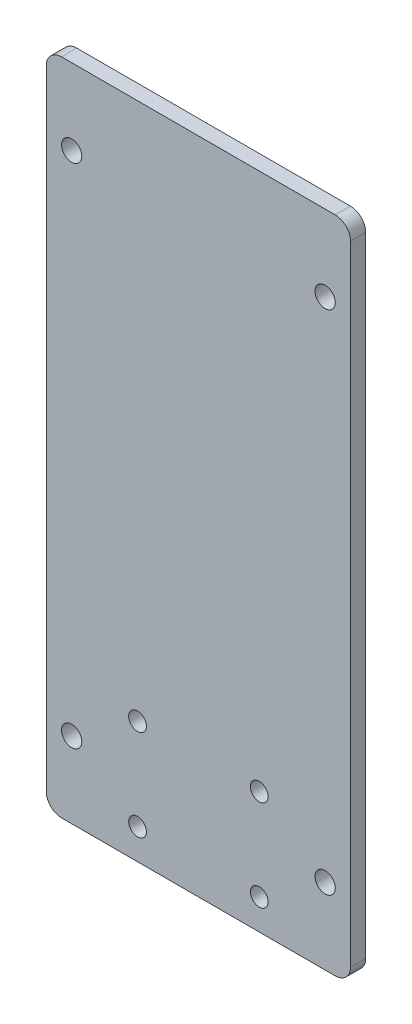
ISO-10303-21;
HEADER;
FILE_DESCRIPTION(('STEP AP214'),'2;1');
FILE_NAME('part.step','',(''),(''),'','','');
FILE_SCHEMA(('AUTOMOTIVE_DESIGN { 1 0 10303 214 1 1 1 1 }'));
ENDSEC;
DATA;
#1=APPLICATION_CONTEXT('core data for automotive mechanical design processes');
#2=APPLICATION_PROTOCOL_DEFINITION('international standard','automotive_design',2000,#1);
#3=PRODUCT_CONTEXT('',#1,'mechanical');
#4=PRODUCT('Part','Part','',(#3));
#5=PRODUCT_RELATED_PRODUCT_CATEGORY('part','',(#4));
#6=PRODUCT_DEFINITION_FORMATION('','',#4);
#7=PRODUCT_DEFINITION_CONTEXT('part definition',#1,'design');
#8=PRODUCT_DEFINITION('design','',#6,#7);
#9=PRODUCT_DEFINITION_SHAPE('','',#8);
#10=(LENGTH_UNIT() NAMED_UNIT(*) SI_UNIT(.MILLI.,.METRE.));
#11=(NAMED_UNIT(*) PLANE_ANGLE_UNIT() SI_UNIT($,.RADIAN.));
#12=(NAMED_UNIT(*) SI_UNIT($,.STERADIAN.) SOLID_ANGLE_UNIT());
#13=UNCERTAINTY_MEASURE_WITH_UNIT(LENGTH_MEASURE(1.E-05),#10,'distance_accuracy_value','');
#14=(GEOMETRIC_REPRESENTATION_CONTEXT(3) GLOBAL_UNCERTAINTY_ASSIGNED_CONTEXT((#13)) GLOBAL_UNIT_ASSIGNED_CONTEXT((#10,
#11,#12)) REPRESENTATION_CONTEXT('',''));
#15=CARTESIAN_POINT('',(0.,0.,0.));
#16=DIRECTION('',(0.,0.,1.));
#17=DIRECTION('',(1.,0.,0.));
#18=AXIS2_PLACEMENT_3D('',#15,#16,#17);
#19=CARTESIAN_POINT('',(0.,0.,3.));
#20=DIRECTION('',(1.,0.,0.));
#21=DIRECTION('',(0.,0.,-1.));
#22=AXIS2_PLACEMENT_3D('',#19,#20,#21);
#23=PLANE('',#22);
#24=DIRECTION('',(0.,-1.,0.));
#25=VECTOR('',#24,1.);
#26=CARTESIAN_POINT('',(0.,0.,0.));
#27=LINE('',#26,#25);
#28=CARTESIAN_POINT('',(0.,127.,0.));
#29=VERTEX_POINT('',#28);
#30=CARTESIAN_POINT('',(0.,3.,0.));
#31=VERTEX_POINT('',#30);
#32=EDGE_CURVE('E131',#29,#31,#27,.T.);
#33=ORIENTED_EDGE('',*,*,#32,.T.);
#34=DIRECTION('',(0.,0.,-1.));
#35=VECTOR('',#34,1.);
#36=CARTESIAN_POINT('',(0.,3.,3.));
#37=LINE('',#36,#35);
#38=CARTESIAN_POINT('',(0.,3.,3.));
#39=VERTEX_POINT('',#38);
#40=EDGE_CURVE('E153',#31,#39,#37,.F.);
#41=ORIENTED_EDGE('',*,*,#40,.T.);
#42=DIRECTION('',(0.,-1.,0.));
#43=VECTOR('',#42,1.);
#44=CARTESIAN_POINT('',(0.,0.,3.));
#45=LINE('',#44,#43);
#46=CARTESIAN_POINT('',(0.,127.,3.));
#47=VERTEX_POINT('',#46);
#48=EDGE_CURVE('E129',#47,#39,#45,.T.);
#49=ORIENTED_EDGE('',*,*,#48,.F.);
#50=DIRECTION('',(0.,0.,-1.));
#51=VECTOR('',#50,1.);
#52=CARTESIAN_POINT('',(0.,127.,3.));
#53=LINE('',#52,#51);
#54=EDGE_CURVE('E150',#47,#29,#53,.T.);
#55=ORIENTED_EDGE('',*,*,#54,.T.);
#56=EDGE_LOOP('',(#33,#41,#49,#55));
#57=FACE_BOUND('',#56,.T.);
#58=ADVANCED_FACE('F34',(#57),#23,.F.);
#59=CARTESIAN_POINT('',(0.,0.,3.));
#60=DIRECTION('',(0.,1.,0.));
#61=DIRECTION('',(0.,0.,1.));
#62=AXIS2_PLACEMENT_3D('',#59,#60,#61);
#63=PLANE('',#62);
#64=DIRECTION('',(1.,0.,0.));
#65=VECTOR('',#64,1.);
#66=CARTESIAN_POINT('',(0.,0.,0.));
#67=LINE('',#66,#65);
#68=CARTESIAN_POINT('',(3.,0.,0.));
#69=VERTEX_POINT('',#68);
#70=CARTESIAN_POINT('',(57.,0.,0.));
#71=VERTEX_POINT('',#70);
#72=EDGE_CURVE('E127',#69,#71,#67,.T.);
#73=ORIENTED_EDGE('',*,*,#72,.T.);
#74=DIRECTION('',(0.,0.,-1.));
#75=VECTOR('',#74,1.);
#76=CARTESIAN_POINT('',(57.,0.,3.));
#77=LINE('',#76,#75);
#78=CARTESIAN_POINT('',(57.,0.,3.));
#79=VERTEX_POINT('',#78);
#80=EDGE_CURVE('E105',#71,#79,#77,.F.);
#81=ORIENTED_EDGE('',*,*,#80,.T.);
#82=DIRECTION('',(1.,0.,0.));
#83=VECTOR('',#82,1.);
#84=CARTESIAN_POINT('',(0.,0.,3.));
#85=LINE('',#84,#83);
#86=CARTESIAN_POINT('',(3.,0.,3.));
#87=VERTEX_POINT('',#86);
#88=EDGE_CURVE('E167',#87,#79,#85,.T.);
#89=ORIENTED_EDGE('',*,*,#88,.F.);
#90=DIRECTION('',(0.,0.,-1.));
#91=VECTOR('',#90,1.);
#92=CARTESIAN_POINT('',(3.,0.,3.));
#93=LINE('',#92,#91);
#94=EDGE_CURVE('E110',#87,#69,#93,.T.);
#95=ORIENTED_EDGE('',*,*,#94,.T.);
#96=EDGE_LOOP('',(#73,#81,#89,#95));
#97=FACE_BOUND('',#96,.T.);
#98=ADVANCED_FACE('F172',(#97),#63,.F.);
#99=CARTESIAN_POINT('',(60.,0.,3.));
#100=DIRECTION('',(-1.,0.,0.));
#101=DIRECTION('',(0.,0.,1.));
#102=AXIS2_PLACEMENT_3D('',#99,#100,#101);
#103=PLANE('',#102);
#104=DIRECTION('',(0.,1.,0.));
#105=VECTOR('',#104,1.);
#106=CARTESIAN_POINT('',(60.,0.,3.));
#107=LINE('',#106,#105);
#108=CARTESIAN_POINT('',(60.,3.,3.));
#109=VERTEX_POINT('',#108);
#110=CARTESIAN_POINT('',(60.,127.,3.));
#111=VERTEX_POINT('',#110);
#112=EDGE_CURVE('E119',#109,#111,#107,.T.);
#113=ORIENTED_EDGE('',*,*,#112,.F.);
#114=DIRECTION('',(0.,0.,-1.));
#115=VECTOR('',#114,1.);
#116=CARTESIAN_POINT('',(60.,3.,3.));
#117=LINE('',#116,#115);
#118=CARTESIAN_POINT('',(60.,3.,0.));
#119=VERTEX_POINT('',#118);
#120=EDGE_CURVE('E104',#109,#119,#117,.T.);
#121=ORIENTED_EDGE('',*,*,#120,.T.);
#122=DIRECTION('',(0.,1.,0.));
#123=VECTOR('',#122,1.);
#124=CARTESIAN_POINT('',(60.,0.,0.));
#125=LINE('',#124,#123);
#126=CARTESIAN_POINT('',(60.,127.,0.));
#127=VERTEX_POINT('',#126);
#128=EDGE_CURVE('E117',#119,#127,#125,.T.);
#129=ORIENTED_EDGE('',*,*,#128,.T.);
#130=DIRECTION('',(0.,0.,-1.));
#131=VECTOR('',#130,1.);
#132=CARTESIAN_POINT('',(60.,127.,3.));
#133=LINE('',#132,#131);
#134=EDGE_CURVE('E121',#127,#111,#133,.F.);
#135=ORIENTED_EDGE('',*,*,#134,.T.);
#136=EDGE_LOOP('',(#113,#121,#129,#135));
#137=FACE_BOUND('',#136,.T.);
#138=ADVANCED_FACE('F116',(#137),#103,.F.);
#139=CARTESIAN_POINT('',(0.,130.,3.));
#140=DIRECTION('',(0.,-1.,0.));
#141=DIRECTION('',(0.,0.,-1.));
#142=AXIS2_PLACEMENT_3D('',#139,#140,#141);
#143=PLANE('',#142);
#144=DIRECTION('',(-1.,0.,0.));
#145=VECTOR('',#144,1.);
#146=CARTESIAN_POINT('',(0.,130.,3.));
#147=LINE('',#146,#145);
#148=CARTESIAN_POINT('',(57.,130.,3.));
#149=VERTEX_POINT('',#148);
#150=CARTESIAN_POINT('',(3.,130.,3.));
#151=VERTEX_POINT('',#150);
#152=EDGE_CURVE('E135',#149,#151,#147,.T.);
#153=ORIENTED_EDGE('',*,*,#152,.F.);
#154=DIRECTION('',(0.,0.,-1.));
#155=VECTOR('',#154,1.);
#156=CARTESIAN_POINT('',(57.,130.,3.));
#157=LINE('',#156,#155);
#158=CARTESIAN_POINT('',(57.,130.,0.));
#159=VERTEX_POINT('',#158);
#160=EDGE_CURVE('E11',#149,#159,#157,.T.);
#161=ORIENTED_EDGE('',*,*,#160,.T.);
#162=DIRECTION('',(-1.,0.,0.));
#163=VECTOR('',#162,1.);
#164=CARTESIAN_POINT('',(0.,130.,0.));
#165=LINE('',#164,#163);
#166=CARTESIAN_POINT('',(3.,130.,0.));
#167=VERTEX_POINT('',#166);
#168=EDGE_CURVE('E126',#159,#167,#165,.T.);
#169=ORIENTED_EDGE('',*,*,#168,.T.);
#170=DIRECTION('',(0.,0.,-1.));
#171=VECTOR('',#170,1.);
#172=CARTESIAN_POINT('',(3.,130.,3.));
#173=LINE('',#172,#171);
#174=EDGE_CURVE('E42',#167,#151,#173,.F.);
#175=ORIENTED_EDGE('',*,*,#174,.T.);
#176=EDGE_LOOP('',(#153,#161,#169,#175));
#177=FACE_BOUND('',#176,.T.);
#178=ADVANCED_FACE('F238',(#177),#143,.F.);
#179=CARTESIAN_POINT('',(0.,0.,3.));
#180=DIRECTION('',(0.,0.,-1.));
#181=DIRECTION('',(-1.,0.,0.));
#182=AXIS2_PLACEMENT_3D('',#179,#180,#181);
#183=PLANE('',#182);
#184=CARTESIAN_POINT('',(18.,24.,3.));
#185=DIRECTION('',(0.,0.,1.));
#186=DIRECTION('',(1.,0.,0.));
#187=AXIS2_PLACEMENT_3D('',#184,#185,#186);
#188=CIRCLE('',#187,1.75);
#189=CARTESIAN_POINT('',(19.75,24.,3.));
#190=VERTEX_POINT('',#189);
#191=EDGE_CURVE('E208',#190,#190,#188,.T.);
#192=ORIENTED_EDGE('',*,*,#191,.F.);
#193=EDGE_LOOP('',(#192));
#194=FACE_BOUND('',#193,.T.);
#195=CARTESIAN_POINT('',(18.,6.,3.));
#196=DIRECTION('',(0.,0.,1.));
#197=DIRECTION('',(1.,0.,0.));
#198=AXIS2_PLACEMENT_3D('',#195,#196,#197);
#199=CIRCLE('',#198,1.75);
#200=CARTESIAN_POINT('',(19.75,6.,3.));
#201=VERTEX_POINT('',#200);
#202=EDGE_CURVE('E214',#201,#201,#199,.T.);
#203=ORIENTED_EDGE('',*,*,#202,.F.);
#204=EDGE_LOOP('',(#203));
#205=FACE_BOUND('',#204,.T.);
#206=CARTESIAN_POINT('',(42.,6.,3.));
#207=DIRECTION('',(0.,0.,1.));
#208=DIRECTION('',(1.,0.,0.));
#209=AXIS2_PLACEMENT_3D('',#206,#207,#208);
#210=CIRCLE('',#209,1.75);
#211=CARTESIAN_POINT('',(43.75,6.,3.));
#212=VERTEX_POINT('',#211);
#213=EDGE_CURVE('E220',#212,#212,#210,.T.);
#214=ORIENTED_EDGE('',*,*,#213,.F.);
#215=EDGE_LOOP('',(#214));
#216=FACE_BOUND('',#215,.T.);
#217=CARTESIAN_POINT('',(42.,24.,3.));
#218=DIRECTION('',(0.,0.,1.));
#219=DIRECTION('',(1.,0.,0.));
#220=AXIS2_PLACEMENT_3D('',#217,#218,#219);
#221=CIRCLE('',#220,1.75);
#222=CARTESIAN_POINT('',(43.75,24.,3.));
#223=VERTEX_POINT('',#222);
#224=EDGE_CURVE('E202',#223,#223,#221,.T.);
#225=ORIENTED_EDGE('',*,*,#224,.F.);
#226=EDGE_LOOP('',(#225));
#227=FACE_BOUND('',#226,.T.);
#228=CARTESIAN_POINT('',(55.,115.,3.));
#229=DIRECTION('',(0.,0.,1.));
#230=DIRECTION('',(1.,0.,0.));
#231=AXIS2_PLACEMENT_3D('',#228,#229,#230);
#232=CIRCLE('',#231,2.);
#233=CARTESIAN_POINT('',(57.,115.,3.));
#234=VERTEX_POINT('',#233);
#235=EDGE_CURVE('E182',#234,#234,#232,.T.);
#236=ORIENTED_EDGE('',*,*,#235,.F.);
#237=EDGE_LOOP('',(#236));
#238=FACE_BOUND('',#237,.T.);
#239=CARTESIAN_POINT('',(5.,15.,3.));
#240=DIRECTION('',(0.,0.,1.));
#241=DIRECTION('',(1.,0.,0.));
#242=AXIS2_PLACEMENT_3D('',#239,#240,#241);
#243=CIRCLE('',#242,2.);
#244=CARTESIAN_POINT('',(7.,15.,3.));
#245=VERTEX_POINT('',#244);
#246=EDGE_CURVE('E187',#245,#245,#243,.T.);
#247=ORIENTED_EDGE('',*,*,#246,.F.);
#248=EDGE_LOOP('',(#247));
#249=FACE_BOUND('',#248,.T.);
#250=CARTESIAN_POINT('',(55.,15.,3.));
#251=DIRECTION('',(0.,0.,1.));
#252=DIRECTION('',(1.,0.,0.));
#253=AXIS2_PLACEMENT_3D('',#250,#251,#252);
#254=CIRCLE('',#253,2.);
#255=CARTESIAN_POINT('',(57.,15.,3.));
#256=VERTEX_POINT('',#255);
#257=EDGE_CURVE('E188',#256,#256,#254,.T.);
#258=ORIENTED_EDGE('',*,*,#257,.F.);
#259=EDGE_LOOP('',(#258));
#260=FACE_BOUND('',#259,.T.);
#261=CARTESIAN_POINT('',(5.,115.,3.));
#262=DIRECTION('',(0.,0.,1.));
#263=DIRECTION('',(1.,0.,0.));
#264=AXIS2_PLACEMENT_3D('',#261,#262,#263);
#265=CIRCLE('',#264,2.);
#266=CARTESIAN_POINT('',(7.,115.,3.));
#267=VERTEX_POINT('',#266);
#268=EDGE_CURVE('E173',#267,#267,#265,.T.);
#269=ORIENTED_EDGE('',*,*,#268,.F.);
#270=EDGE_LOOP('',(#269));
#271=FACE_BOUND('',#270,.T.);
#272=ORIENTED_EDGE('',*,*,#88,.T.);
#273=CARTESIAN_POINT('',(57.,3.,3.));
#274=DIRECTION('',(0.,0.,-1.));
#275=DIRECTION('',(-1.,0.,0.));
#276=AXIS2_PLACEMENT_3D('',#273,#274,#275);
#277=CIRCLE('',#276,3.);
#278=EDGE_CURVE('E148',#79,#109,#277,.F.);
#279=ORIENTED_EDGE('',*,*,#278,.T.);
#280=ORIENTED_EDGE('',*,*,#112,.T.);
#281=CARTESIAN_POINT('',(57.,127.,3.));
#282=DIRECTION('',(0.,0.,-1.));
#283=DIRECTION('',(-1.,0.,0.));
#284=AXIS2_PLACEMENT_3D('',#281,#282,#283);
#285=CIRCLE('',#284,3.);
#286=EDGE_CURVE('E55',#111,#149,#285,.F.);
#287=ORIENTED_EDGE('',*,*,#286,.T.);
#288=ORIENTED_EDGE('',*,*,#152,.T.);
#289=CARTESIAN_POINT('',(3.,127.,3.));
#290=DIRECTION('',(0.,0.,-1.));
#291=DIRECTION('',(-1.,0.,0.));
#292=AXIS2_PLACEMENT_3D('',#289,#290,#291);
#293=CIRCLE('',#292,3.);
#294=EDGE_CURVE('E143',#151,#47,#293,.F.);
#295=ORIENTED_EDGE('',*,*,#294,.T.);
#296=ORIENTED_EDGE('',*,*,#48,.T.);
#297=CARTESIAN_POINT('',(3.,3.,3.));
#298=DIRECTION('',(0.,0.,-1.));
#299=DIRECTION('',(-1.,0.,0.));
#300=AXIS2_PLACEMENT_3D('',#297,#298,#299);
#301=CIRCLE('',#300,3.);
#302=EDGE_CURVE('E146',#39,#87,#301,.F.);
#303=ORIENTED_EDGE('',*,*,#302,.T.);
#304=EDGE_LOOP('',(#272,#279,#280,#287,#288,#295,#296,#303));
#305=FACE_BOUND('',#304,.T.);
#306=ADVANCED_FACE('F164',(#194,#205,#216,#227,#238,#249,#260,#271,#305),#183,.F.);
#307=CARTESIAN_POINT('',(0.,0.,0.));
#308=DIRECTION('',(0.,0.,-1.));
#309=DIRECTION('',(-1.,0.,0.));
#310=AXIS2_PLACEMENT_3D('',#307,#308,#309);
#311=PLANE('',#310);
#312=CARTESIAN_POINT('',(18.,24.,0.));
#313=DIRECTION('',(0.,0.,1.));
#314=DIRECTION('',(1.,0.,0.));
#315=AXIS2_PLACEMENT_3D('',#312,#313,#314);
#316=CIRCLE('',#315,1.75);
#317=CARTESIAN_POINT('',(19.75,24.,0.));
#318=VERTEX_POINT('',#317);
#319=EDGE_CURVE('E211',#318,#318,#316,.T.);
#320=ORIENTED_EDGE('',*,*,#319,.T.);
#321=EDGE_LOOP('',(#320));
#322=FACE_BOUND('',#321,.T.);
#323=CARTESIAN_POINT('',(18.,6.,0.));
#324=DIRECTION('',(0.,0.,1.));
#325=DIRECTION('',(1.,0.,0.));
#326=AXIS2_PLACEMENT_3D('',#323,#324,#325);
#327=CIRCLE('',#326,1.75);
#328=CARTESIAN_POINT('',(19.75,6.,0.));
#329=VERTEX_POINT('',#328);
#330=EDGE_CURVE('E217',#329,#329,#327,.T.);
#331=ORIENTED_EDGE('',*,*,#330,.T.);
#332=EDGE_LOOP('',(#331));
#333=FACE_BOUND('',#332,.T.);
#334=CARTESIAN_POINT('',(42.,6.,0.));
#335=DIRECTION('',(0.,0.,1.));
#336=DIRECTION('',(1.,0.,0.));
#337=AXIS2_PLACEMENT_3D('',#334,#335,#336);
#338=CIRCLE('',#337,1.75);
#339=CARTESIAN_POINT('',(43.75,6.,0.));
#340=VERTEX_POINT('',#339);
#341=EDGE_CURVE('E205',#340,#340,#338,.T.);
#342=ORIENTED_EDGE('',*,*,#341,.T.);
#343=EDGE_LOOP('',(#342));
#344=FACE_BOUND('',#343,.T.);
#345=CARTESIAN_POINT('',(42.,24.,0.));
#346=DIRECTION('',(0.,0.,1.));
#347=DIRECTION('',(1.,0.,0.));
#348=AXIS2_PLACEMENT_3D('',#345,#346,#347);
#349=CIRCLE('',#348,1.75);
#350=CARTESIAN_POINT('',(43.75,24.,0.));
#351=VERTEX_POINT('',#350);
#352=EDGE_CURVE('E199',#351,#351,#349,.T.);
#353=ORIENTED_EDGE('',*,*,#352,.T.);
#354=EDGE_LOOP('',(#353));
#355=FACE_BOUND('',#354,.T.);
#356=CARTESIAN_POINT('',(55.,115.,0.));
#357=DIRECTION('',(0.,0.,-1.));
#358=DIRECTION('',(-1.,0.,0.));
#359=AXIS2_PLACEMENT_3D('',#356,#357,#358);
#360=CIRCLE('',#359,2.);
#361=CARTESIAN_POINT('',(57.,115.,0.));
#362=VERTEX_POINT('',#361);
#363=EDGE_CURVE('E191',#362,#362,#360,.F.);
#364=ORIENTED_EDGE('',*,*,#363,.T.);
#365=EDGE_LOOP('',(#364));
#366=FACE_BOUND('',#365,.T.);
#367=CARTESIAN_POINT('',(5.,15.,0.));
#368=DIRECTION('',(0.,0.,-1.));
#369=DIRECTION('',(-1.,0.,0.));
#370=AXIS2_PLACEMENT_3D('',#367,#368,#369);
#371=CIRCLE('',#370,2.);
#372=CARTESIAN_POINT('',(7.,15.,0.));
#373=VERTEX_POINT('',#372);
#374=EDGE_CURVE('E184',#373,#373,#371,.F.);
#375=ORIENTED_EDGE('',*,*,#374,.T.);
#376=EDGE_LOOP('',(#375));
#377=FACE_BOUND('',#376,.T.);
#378=CARTESIAN_POINT('',(55.,15.,0.));
#379=DIRECTION('',(0.,0.,-1.));
#380=DIRECTION('',(-1.,0.,0.));
#381=AXIS2_PLACEMENT_3D('',#378,#379,#380);
#382=CIRCLE('',#381,2.);
#383=CARTESIAN_POINT('',(57.,15.,0.));
#384=VERTEX_POINT('',#383);
#385=EDGE_CURVE('E196',#384,#384,#382,.F.);
#386=ORIENTED_EDGE('',*,*,#385,.T.);
#387=EDGE_LOOP('',(#386));
#388=FACE_BOUND('',#387,.T.);
#389=CARTESIAN_POINT('',(5.,115.,0.));
#390=DIRECTION('',(0.,0.,-1.));
#391=DIRECTION('',(-1.,0.,0.));
#392=AXIS2_PLACEMENT_3D('',#389,#390,#391);
#393=CIRCLE('',#392,2.);
#394=CARTESIAN_POINT('',(7.,115.,0.));
#395=VERTEX_POINT('',#394);
#396=EDGE_CURVE('E175',#395,#395,#393,.F.);
#397=ORIENTED_EDGE('',*,*,#396,.T.);
#398=EDGE_LOOP('',(#397));
#399=FACE_BOUND('',#398,.T.);
#400=ORIENTED_EDGE('',*,*,#128,.F.);
#401=CARTESIAN_POINT('',(57.,3.,0.));
#402=DIRECTION('',(0.,0.,-1.));
#403=DIRECTION('',(-1.,0.,0.));
#404=AXIS2_PLACEMENT_3D('',#401,#402,#403);
#405=CIRCLE('',#404,3.);
#406=EDGE_CURVE('E100',#119,#71,#405,.T.);
#407=ORIENTED_EDGE('',*,*,#406,.T.);
#408=ORIENTED_EDGE('',*,*,#72,.F.);
#409=CARTESIAN_POINT('',(3.,3.,0.));
#410=DIRECTION('',(0.,0.,-1.));
#411=DIRECTION('',(-1.,0.,0.));
#412=AXIS2_PLACEMENT_3D('',#409,#410,#411);
#413=CIRCLE('',#412,3.);
#414=EDGE_CURVE('E111',#69,#31,#413,.T.);
#415=ORIENTED_EDGE('',*,*,#414,.T.);
#416=ORIENTED_EDGE('',*,*,#32,.F.);
#417=CARTESIAN_POINT('',(3.,127.,0.));
#418=DIRECTION('',(0.,0.,-1.));
#419=DIRECTION('',(-1.,0.,0.));
#420=AXIS2_PLACEMENT_3D('',#417,#418,#419);
#421=CIRCLE('',#420,3.);
#422=EDGE_CURVE('E120',#29,#167,#421,.T.);
#423=ORIENTED_EDGE('',*,*,#422,.T.);
#424=ORIENTED_EDGE('',*,*,#168,.F.);
#425=CARTESIAN_POINT('',(57.,127.,0.));
#426=DIRECTION('',(0.,0.,-1.));
#427=DIRECTION('',(-1.,0.,0.));
#428=AXIS2_PLACEMENT_3D('',#425,#426,#427);
#429=CIRCLE('',#428,3.);
#430=EDGE_CURVE('E125',#159,#127,#429,.T.);
#431=ORIENTED_EDGE('',*,*,#430,.T.);
#432=EDGE_LOOP('',(#400,#407,#408,#415,#416,#423,#424,#431));
#433=FACE_BOUND('',#432,.T.);
#434=ADVANCED_FACE('F123',(#322,#333,#344,#355,#366,#377,#388,#399,#433),#311,.T.);
#435=CARTESIAN_POINT('',(5.,115.,-0.00100000000000013));
#436=DIRECTION('',(0.,0.,1.));
#437=DIRECTION('',(1.,0.,0.));
#438=AXIS2_PLACEMENT_3D('',#435,#436,#437);
#439=CYLINDRICAL_SURFACE('',#438,2.);
#440=CARTESIAN_POINT('',(7.,115.,0.));
#441=CARTESIAN_POINT('',(7.,115.,0.03125));
#442=CARTESIAN_POINT('',(7.,115.,0.0625));
#443=CARTESIAN_POINT('',(7.,115.,0.125));
#444=CARTESIAN_POINT('',(7.,115.,0.15625));
#445=CARTESIAN_POINT('',(7.,115.,0.21875));
#446=CARTESIAN_POINT('',(7.,115.,0.25));
#447=CARTESIAN_POINT('',(7.,115.,0.3125));
#448=CARTESIAN_POINT('',(7.,115.,0.34375));
#449=CARTESIAN_POINT('',(7.,115.,0.40625));
#450=CARTESIAN_POINT('',(7.,115.,0.4375));
#451=CARTESIAN_POINT('',(7.,115.,0.5));
#452=CARTESIAN_POINT('',(7.,115.,0.53125));
#453=CARTESIAN_POINT('',(7.,115.,0.59375));
#454=CARTESIAN_POINT('',(7.,115.,0.625));
#455=CARTESIAN_POINT('',(7.,115.,0.6875));
#456=CARTESIAN_POINT('',(7.,115.,0.71875));
#457=CARTESIAN_POINT('',(7.,115.,0.78125));
#458=CARTESIAN_POINT('',(7.,115.,0.8125));
#459=CARTESIAN_POINT('',(7.,115.,0.875));
#460=CARTESIAN_POINT('',(7.,115.,0.90625));
#461=CARTESIAN_POINT('',(7.,115.,0.96875));
#462=CARTESIAN_POINT('',(7.,115.,1.));
#463=CARTESIAN_POINT('',(7.,115.,1.0625));
#464=CARTESIAN_POINT('',(7.,115.,1.09375));
#465=CARTESIAN_POINT('',(7.,115.,1.15625));
#466=CARTESIAN_POINT('',(7.,115.,1.1875));
#467=CARTESIAN_POINT('',(7.,115.,1.25));
#468=CARTESIAN_POINT('',(7.,115.,1.28125));
#469=CARTESIAN_POINT('',(7.,115.,1.34375));
#470=CARTESIAN_POINT('',(7.,115.,1.375));
#471=CARTESIAN_POINT('',(7.,115.,1.4375));
#472=CARTESIAN_POINT('',(7.,115.,1.46875));
#473=CARTESIAN_POINT('',(7.,115.,1.53125));
#474=CARTESIAN_POINT('',(7.,115.,1.5625));
#475=CARTESIAN_POINT('',(7.,115.,1.625));
#476=CARTESIAN_POINT('',(7.,115.,1.65625));
#477=CARTESIAN_POINT('',(7.,115.,1.71875));
#478=CARTESIAN_POINT('',(7.,115.,1.75));
#479=CARTESIAN_POINT('',(7.,115.,1.8125));
#480=CARTESIAN_POINT('',(7.,115.,1.84375));
#481=CARTESIAN_POINT('',(7.,115.,1.90625));
#482=CARTESIAN_POINT('',(7.,115.,1.9375));
#483=CARTESIAN_POINT('',(7.,115.,2.));
#484=CARTESIAN_POINT('',(7.,115.,2.03125));
#485=CARTESIAN_POINT('',(7.,115.,2.09375));
#486=CARTESIAN_POINT('',(7.,115.,2.125));
#487=CARTESIAN_POINT('',(7.,115.,2.1875));
#488=CARTESIAN_POINT('',(7.,115.,2.21875));
#489=CARTESIAN_POINT('',(7.,115.,2.28125));
#490=CARTESIAN_POINT('',(7.,115.,2.3125));
#491=CARTESIAN_POINT('',(7.,115.,2.375));
#492=CARTESIAN_POINT('',(7.,115.,2.40625));
#493=CARTESIAN_POINT('',(7.,115.,2.46875));
#494=CARTESIAN_POINT('',(7.,115.,2.5));
#495=CARTESIAN_POINT('',(7.,115.,2.5625));
#496=CARTESIAN_POINT('',(7.,115.,2.59375));
#497=CARTESIAN_POINT('',(7.,115.,2.65625));
#498=CARTESIAN_POINT('',(7.,115.,2.6875));
#499=CARTESIAN_POINT('',(7.,115.,2.75));
#500=CARTESIAN_POINT('',(7.,115.,2.78125));
#501=CARTESIAN_POINT('',(7.,115.,2.84375));
#502=CARTESIAN_POINT('',(7.,115.,2.875));
#503=CARTESIAN_POINT('',(7.,115.,2.9375));
#504=CARTESIAN_POINT('',(7.,115.,2.96875));
#505=CARTESIAN_POINT('',(7.,115.,3.));
#506=B_SPLINE_CURVE_WITH_KNOTS('',3,(#440,#441,#442,#443,#444,#445,#446,#447,#448,#449,#450,
#451,#452,#453,#454,#455,#456,#457,#458,#459,#460,#461,#462,#463,#464,#465,#466,#467,#468,#469,
#470,#471,#472,#473,#474,#475,#476,#477,#478,#479,#480,#481,#482,#483,#484,#485,#486,#487,#488,
#489,#490,#491,#492,#493,#494,#495,#496,#497,#498,#499,#500,#501,#502,#503,#504,#505),
.UNSPECIFIED.,.F.,.F.,(4,2,2,2,2,2,2,2,2,2,2,2,2,2,2,2,2,2,2,2,2,2,2,2,2,2,2,2,2,2,2,2,4),(0.,
0.09375,0.1875,0.28125,0.375,0.46875,0.5625,0.65625,0.75,0.84375,0.9375,1.03125,1.125,1.21875,
1.3125,1.40625,1.5,1.59375,1.6875,1.78125,1.875,1.96875,2.0625,2.15625,2.25,2.34375,2.4375,
2.53125,2.625,2.71875,2.8125,2.90625,3.),.UNSPECIFIED.);
#507=EDGE_CURVE('BSEAM251',#395,#267,#506,.T.);
#508=ORIENTED_EDGE('',*,*,#396,.F.);
#509=ORIENTED_EDGE('',*,*,#268,.T.);
#510=ORIENTED_EDGE('',*,*,#507,.T.);
#511=ORIENTED_EDGE('',*,*,#507,.F.);
#512=EDGE_LOOP('',(#508,#510,#509,#511));
#513=FACE_BOUND('',#512,.T.);
#514=ADVANCED_FACE('F251',(#513),#439,.F.);
#515=CARTESIAN_POINT('',(55.,15.,-0.00100000000000013));
#516=DIRECTION('',(0.,0.,1.));
#517=DIRECTION('',(1.,0.,0.));
#518=AXIS2_PLACEMENT_3D('',#515,#516,#517);
#519=CYLINDRICAL_SURFACE('',#518,2.);
#520=CARTESIAN_POINT('',(57.,15.,0.));
#521=CARTESIAN_POINT('',(57.,15.,0.03125));
#522=CARTESIAN_POINT('',(57.,15.,0.0625));
#523=CARTESIAN_POINT('',(57.,15.,0.125));
#524=CARTESIAN_POINT('',(57.,15.,0.15625));
#525=CARTESIAN_POINT('',(57.,15.,0.21875));
#526=CARTESIAN_POINT('',(57.,15.,0.25));
#527=CARTESIAN_POINT('',(57.,15.,0.3125));
#528=CARTESIAN_POINT('',(57.,15.,0.34375));
#529=CARTESIAN_POINT('',(57.,15.,0.40625));
#530=CARTESIAN_POINT('',(57.,15.,0.4375));
#531=CARTESIAN_POINT('',(57.,15.,0.5));
#532=CARTESIAN_POINT('',(57.,15.,0.53125));
#533=CARTESIAN_POINT('',(57.,15.,0.59375));
#534=CARTESIAN_POINT('',(57.,15.,0.625));
#535=CARTESIAN_POINT('',(57.,15.,0.6875));
#536=CARTESIAN_POINT('',(57.,15.,0.71875));
#537=CARTESIAN_POINT('',(57.,15.,0.78125));
#538=CARTESIAN_POINT('',(57.,15.,0.8125));
#539=CARTESIAN_POINT('',(57.,15.,0.875));
#540=CARTESIAN_POINT('',(57.,15.,0.90625));
#541=CARTESIAN_POINT('',(57.,15.,0.96875));
#542=CARTESIAN_POINT('',(57.,15.,1.));
#543=CARTESIAN_POINT('',(57.,15.,1.0625));
#544=CARTESIAN_POINT('',(57.,15.,1.09375));
#545=CARTESIAN_POINT('',(57.,15.,1.15625));
#546=CARTESIAN_POINT('',(57.,15.,1.1875));
#547=CARTESIAN_POINT('',(57.,15.,1.25));
#548=CARTESIAN_POINT('',(57.,15.,1.28125));
#549=CARTESIAN_POINT('',(57.,15.,1.34375));
#550=CARTESIAN_POINT('',(57.,15.,1.375));
#551=CARTESIAN_POINT('',(57.,15.,1.4375));
#552=CARTESIAN_POINT('',(57.,15.,1.46875));
#553=CARTESIAN_POINT('',(57.,15.,1.53125));
#554=CARTESIAN_POINT('',(57.,15.,1.5625));
#555=CARTESIAN_POINT('',(57.,15.,1.625));
#556=CARTESIAN_POINT('',(57.,15.,1.65625));
#557=CARTESIAN_POINT('',(57.,15.,1.71875));
#558=CARTESIAN_POINT('',(57.,15.,1.75));
#559=CARTESIAN_POINT('',(57.,15.,1.8125));
#560=CARTESIAN_POINT('',(57.,15.,1.84375));
#561=CARTESIAN_POINT('',(57.,15.,1.90625));
#562=CARTESIAN_POINT('',(57.,15.,1.9375));
#563=CARTESIAN_POINT('',(57.,15.,2.));
#564=CARTESIAN_POINT('',(57.,15.,2.03125));
#565=CARTESIAN_POINT('',(57.,15.,2.09375));
#566=CARTESIAN_POINT('',(57.,15.,2.125));
#567=CARTESIAN_POINT('',(57.,15.,2.1875));
#568=CARTESIAN_POINT('',(57.,15.,2.21875));
#569=CARTESIAN_POINT('',(57.,15.,2.28125));
#570=CARTESIAN_POINT('',(57.,15.,2.3125));
#571=CARTESIAN_POINT('',(57.,15.,2.375));
#572=CARTESIAN_POINT('',(57.,15.,2.40625));
#573=CARTESIAN_POINT('',(57.,15.,2.46875));
#574=CARTESIAN_POINT('',(57.,15.,2.5));
#575=CARTESIAN_POINT('',(57.,15.,2.5625));
#576=CARTESIAN_POINT('',(57.,15.,2.59375));
#577=CARTESIAN_POINT('',(57.,15.,2.65625));
#578=CARTESIAN_POINT('',(57.,15.,2.6875));
#579=CARTESIAN_POINT('',(57.,15.,2.75));
#580=CARTESIAN_POINT('',(57.,15.,2.78125));
#581=CARTESIAN_POINT('',(57.,15.,2.84375));
#582=CARTESIAN_POINT('',(57.,15.,2.875));
#583=CARTESIAN_POINT('',(57.,15.,2.9375));
#584=CARTESIAN_POINT('',(57.,15.,2.96875));
#585=CARTESIAN_POINT('',(57.,15.,3.));
#586=B_SPLINE_CURVE_WITH_KNOTS('',3,(#520,#521,#522,#523,#524,#525,#526,#527,#528,#529,#530,
#531,#532,#533,#534,#535,#536,#537,#538,#539,#540,#541,#542,#543,#544,#545,#546,#547,#548,#549,
#550,#551,#552,#553,#554,#555,#556,#557,#558,#559,#560,#561,#562,#563,#564,#565,#566,#567,#568,
#569,#570,#571,#572,#573,#574,#575,#576,#577,#578,#579,#580,#581,#582,#583,#584,#585),
.UNSPECIFIED.,.F.,.F.,(4,2,2,2,2,2,2,2,2,2,2,2,2,2,2,2,2,2,2,2,2,2,2,2,2,2,2,2,2,2,2,2,4),(0.,
0.09375,0.1875,0.28125,0.375,0.46875,0.5625,0.65625,0.75,0.84375,0.9375,1.03125,1.125,1.21875,
1.3125,1.40625,1.5,1.59375,1.6875,1.78125,1.875,1.96875,2.0625,2.15625,2.25,2.34375,2.4375,
2.53125,2.625,2.71875,2.8125,2.90625,3.),.UNSPECIFIED.);
#587=EDGE_CURVE('BSEAM253',#384,#256,#586,.T.);
#588=ORIENTED_EDGE('',*,*,#385,.F.);
#589=ORIENTED_EDGE('',*,*,#257,.T.);
#590=ORIENTED_EDGE('',*,*,#587,.T.);
#591=ORIENTED_EDGE('',*,*,#587,.F.);
#592=EDGE_LOOP('',(#588,#590,#589,#591));
#593=FACE_BOUND('',#592,.T.);
#594=ADVANCED_FACE('F253',(#593),#519,.F.);
#595=CARTESIAN_POINT('',(5.,15.,-0.00100000000000013));
#596=DIRECTION('',(0.,0.,1.));
#597=DIRECTION('',(1.,0.,0.));
#598=AXIS2_PLACEMENT_3D('',#595,#596,#597);
#599=CYLINDRICAL_SURFACE('',#598,2.);
#600=CARTESIAN_POINT('',(7.,15.,0.));
#601=CARTESIAN_POINT('',(7.,15.,0.03125));
#602=CARTESIAN_POINT('',(7.,15.,0.0625));
#603=CARTESIAN_POINT('',(7.,15.,0.125));
#604=CARTESIAN_POINT('',(7.,15.,0.15625));
#605=CARTESIAN_POINT('',(7.,15.,0.21875));
#606=CARTESIAN_POINT('',(7.,15.,0.25));
#607=CARTESIAN_POINT('',(7.,15.,0.3125));
#608=CARTESIAN_POINT('',(7.,15.,0.34375));
#609=CARTESIAN_POINT('',(7.,15.,0.40625));
#610=CARTESIAN_POINT('',(7.,15.,0.4375));
#611=CARTESIAN_POINT('',(7.,15.,0.5));
#612=CARTESIAN_POINT('',(7.,15.,0.53125));
#613=CARTESIAN_POINT('',(7.,15.,0.59375));
#614=CARTESIAN_POINT('',(7.,15.,0.625));
#615=CARTESIAN_POINT('',(7.,15.,0.6875));
#616=CARTESIAN_POINT('',(7.,15.,0.71875));
#617=CARTESIAN_POINT('',(7.,15.,0.78125));
#618=CARTESIAN_POINT('',(7.,15.,0.8125));
#619=CARTESIAN_POINT('',(7.,15.,0.875));
#620=CARTESIAN_POINT('',(7.,15.,0.90625));
#621=CARTESIAN_POINT('',(7.,15.,0.96875));
#622=CARTESIAN_POINT('',(7.,15.,1.));
#623=CARTESIAN_POINT('',(7.,15.,1.0625));
#624=CARTESIAN_POINT('',(7.,15.,1.09375));
#625=CARTESIAN_POINT('',(7.,15.,1.15625));
#626=CARTESIAN_POINT('',(7.,15.,1.1875));
#627=CARTESIAN_POINT('',(7.,15.,1.25));
#628=CARTESIAN_POINT('',(7.,15.,1.28125));
#629=CARTESIAN_POINT('',(7.,15.,1.34375));
#630=CARTESIAN_POINT('',(7.,15.,1.375));
#631=CARTESIAN_POINT('',(7.,15.,1.4375));
#632=CARTESIAN_POINT('',(7.,15.,1.46875));
#633=CARTESIAN_POINT('',(7.,15.,1.53125));
#634=CARTESIAN_POINT('',(7.,15.,1.5625));
#635=CARTESIAN_POINT('',(7.,15.,1.625));
#636=CARTESIAN_POINT('',(7.,15.,1.65625));
#637=CARTESIAN_POINT('',(7.,15.,1.71875));
#638=CARTESIAN_POINT('',(7.,15.,1.75));
#639=CARTESIAN_POINT('',(7.,15.,1.8125));
#640=CARTESIAN_POINT('',(7.,15.,1.84375));
#641=CARTESIAN_POINT('',(7.,15.,1.90625));
#642=CARTESIAN_POINT('',(7.,15.,1.9375));
#643=CARTESIAN_POINT('',(7.,15.,2.));
#644=CARTESIAN_POINT('',(7.,15.,2.03125));
#645=CARTESIAN_POINT('',(7.,15.,2.09375));
#646=CARTESIAN_POINT('',(7.,15.,2.125));
#647=CARTESIAN_POINT('',(7.,15.,2.1875));
#648=CARTESIAN_POINT('',(7.,15.,2.21875));
#649=CARTESIAN_POINT('',(7.,15.,2.28125));
#650=CARTESIAN_POINT('',(7.,15.,2.3125));
#651=CARTESIAN_POINT('',(7.,15.,2.375));
#652=CARTESIAN_POINT('',(7.,15.,2.40625));
#653=CARTESIAN_POINT('',(7.,15.,2.46875));
#654=CARTESIAN_POINT('',(7.,15.,2.5));
#655=CARTESIAN_POINT('',(7.,15.,2.5625));
#656=CARTESIAN_POINT('',(7.,15.,2.59375));
#657=CARTESIAN_POINT('',(7.,15.,2.65625));
#658=CARTESIAN_POINT('',(7.,15.,2.6875));
#659=CARTESIAN_POINT('',(7.,15.,2.75));
#660=CARTESIAN_POINT('',(7.,15.,2.78125));
#661=CARTESIAN_POINT('',(7.,15.,2.84375));
#662=CARTESIAN_POINT('',(7.,15.,2.875));
#663=CARTESIAN_POINT('',(7.,15.,2.9375));
#664=CARTESIAN_POINT('',(7.,15.,2.96875));
#665=CARTESIAN_POINT('',(7.,15.,3.));
#666=B_SPLINE_CURVE_WITH_KNOTS('',3,(#600,#601,#602,#603,#604,#605,#606,#607,#608,#609,#610,
#611,#612,#613,#614,#615,#616,#617,#618,#619,#620,#621,#622,#623,#624,#625,#626,#627,#628,#629,
#630,#631,#632,#633,#634,#635,#636,#637,#638,#639,#640,#641,#642,#643,#644,#645,#646,#647,#648,
#649,#650,#651,#652,#653,#654,#655,#656,#657,#658,#659,#660,#661,#662,#663,#664,#665),
.UNSPECIFIED.,.F.,.F.,(4,2,2,2,2,2,2,2,2,2,2,2,2,2,2,2,2,2,2,2,2,2,2,2,2,2,2,2,2,2,2,2,4),(0.,
0.09375,0.1875,0.28125,0.375,0.46875,0.5625,0.65625,0.75,0.84375,0.9375,1.03125,1.125,1.21875,
1.3125,1.40625,1.5,1.59375,1.6875,1.78125,1.875,1.96875,2.0625,2.15625,2.25,2.34375,2.4375,
2.53125,2.625,2.71875,2.8125,2.90625,3.),.UNSPECIFIED.);
#667=EDGE_CURVE('BSEAM260',#373,#245,#666,.T.);
#668=ORIENTED_EDGE('',*,*,#374,.F.);
#669=ORIENTED_EDGE('',*,*,#246,.T.);
#670=ORIENTED_EDGE('',*,*,#667,.T.);
#671=ORIENTED_EDGE('',*,*,#667,.F.);
#672=EDGE_LOOP('',(#668,#670,#669,#671));
#673=FACE_BOUND('',#672,.T.);
#674=ADVANCED_FACE('F260',(#673),#599,.F.);
#675=CARTESIAN_POINT('',(55.,115.,-0.00100000000000013));
#676=DIRECTION('',(0.,0.,1.));
#677=DIRECTION('',(1.,0.,0.));
#678=AXIS2_PLACEMENT_3D('',#675,#676,#677);
#679=CYLINDRICAL_SURFACE('',#678,2.);
#680=CARTESIAN_POINT('',(57.,115.,0.));
#681=CARTESIAN_POINT('',(57.,115.,0.03125));
#682=CARTESIAN_POINT('',(57.,115.,0.0625));
#683=CARTESIAN_POINT('',(57.,115.,0.125));
#684=CARTESIAN_POINT('',(57.,115.,0.15625));
#685=CARTESIAN_POINT('',(57.,115.,0.21875));
#686=CARTESIAN_POINT('',(57.,115.,0.25));
#687=CARTESIAN_POINT('',(57.,115.,0.3125));
#688=CARTESIAN_POINT('',(57.,115.,0.34375));
#689=CARTESIAN_POINT('',(57.,115.,0.40625));
#690=CARTESIAN_POINT('',(57.,115.,0.4375));
#691=CARTESIAN_POINT('',(57.,115.,0.5));
#692=CARTESIAN_POINT('',(57.,115.,0.53125));
#693=CARTESIAN_POINT('',(57.,115.,0.59375));
#694=CARTESIAN_POINT('',(57.,115.,0.625));
#695=CARTESIAN_POINT('',(57.,115.,0.6875));
#696=CARTESIAN_POINT('',(57.,115.,0.71875));
#697=CARTESIAN_POINT('',(57.,115.,0.78125));
#698=CARTESIAN_POINT('',(57.,115.,0.8125));
#699=CARTESIAN_POINT('',(57.,115.,0.875));
#700=CARTESIAN_POINT('',(57.,115.,0.90625));
#701=CARTESIAN_POINT('',(57.,115.,0.96875));
#702=CARTESIAN_POINT('',(57.,115.,1.));
#703=CARTESIAN_POINT('',(57.,115.,1.0625));
#704=CARTESIAN_POINT('',(57.,115.,1.09375));
#705=CARTESIAN_POINT('',(57.,115.,1.15625));
#706=CARTESIAN_POINT('',(57.,115.,1.1875));
#707=CARTESIAN_POINT('',(57.,115.,1.25));
#708=CARTESIAN_POINT('',(57.,115.,1.28125));
#709=CARTESIAN_POINT('',(57.,115.,1.34375));
#710=CARTESIAN_POINT('',(57.,115.,1.375));
#711=CARTESIAN_POINT('',(57.,115.,1.4375));
#712=CARTESIAN_POINT('',(57.,115.,1.46875));
#713=CARTESIAN_POINT('',(57.,115.,1.53125));
#714=CARTESIAN_POINT('',(57.,115.,1.5625));
#715=CARTESIAN_POINT('',(57.,115.,1.625));
#716=CARTESIAN_POINT('',(57.,115.,1.65625));
#717=CARTESIAN_POINT('',(57.,115.,1.71875));
#718=CARTESIAN_POINT('',(57.,115.,1.75));
#719=CARTESIAN_POINT('',(57.,115.,1.8125));
#720=CARTESIAN_POINT('',(57.,115.,1.84375));
#721=CARTESIAN_POINT('',(57.,115.,1.90625));
#722=CARTESIAN_POINT('',(57.,115.,1.9375));
#723=CARTESIAN_POINT('',(57.,115.,2.));
#724=CARTESIAN_POINT('',(57.,115.,2.03125));
#725=CARTESIAN_POINT('',(57.,115.,2.09375));
#726=CARTESIAN_POINT('',(57.,115.,2.125));
#727=CARTESIAN_POINT('',(57.,115.,2.1875));
#728=CARTESIAN_POINT('',(57.,115.,2.21875));
#729=CARTESIAN_POINT('',(57.,115.,2.28125));
#730=CARTESIAN_POINT('',(57.,115.,2.3125));
#731=CARTESIAN_POINT('',(57.,115.,2.375));
#732=CARTESIAN_POINT('',(57.,115.,2.40625));
#733=CARTESIAN_POINT('',(57.,115.,2.46875));
#734=CARTESIAN_POINT('',(57.,115.,2.5));
#735=CARTESIAN_POINT('',(57.,115.,2.5625));
#736=CARTESIAN_POINT('',(57.,115.,2.59375));
#737=CARTESIAN_POINT('',(57.,115.,2.65625));
#738=CARTESIAN_POINT('',(57.,115.,2.6875));
#739=CARTESIAN_POINT('',(57.,115.,2.75));
#740=CARTESIAN_POINT('',(57.,115.,2.78125));
#741=CARTESIAN_POINT('',(57.,115.,2.84375));
#742=CARTESIAN_POINT('',(57.,115.,2.875));
#743=CARTESIAN_POINT('',(57.,115.,2.9375));
#744=CARTESIAN_POINT('',(57.,115.,2.96875));
#745=CARTESIAN_POINT('',(57.,115.,3.));
#746=B_SPLINE_CURVE_WITH_KNOTS('',3,(#680,#681,#682,#683,#684,#685,#686,#687,#688,#689,#690,
#691,#692,#693,#694,#695,#696,#697,#698,#699,#700,#701,#702,#703,#704,#705,#706,#707,#708,#709,
#710,#711,#712,#713,#714,#715,#716,#717,#718,#719,#720,#721,#722,#723,#724,#725,#726,#727,#728,
#729,#730,#731,#732,#733,#734,#735,#736,#737,#738,#739,#740,#741,#742,#743,#744,#745),
.UNSPECIFIED.,.F.,.F.,(4,2,2,2,2,2,2,2,2,2,2,2,2,2,2,2,2,2,2,2,2,2,2,2,2,2,2,2,2,2,2,2,4),(0.,
0.09375,0.1875,0.28125,0.375,0.46875,0.5625,0.65625,0.75,0.84375,0.9375,1.03125,1.125,1.21875,
1.3125,1.40625,1.5,1.59375,1.6875,1.78125,1.875,1.96875,2.0625,2.15625,2.25,2.34375,2.4375,
2.53125,2.625,2.71875,2.8125,2.90625,3.),.UNSPECIFIED.);
#747=EDGE_CURVE('BSEAM277',#362,#234,#746,.T.);
#748=ORIENTED_EDGE('',*,*,#363,.F.);
#749=ORIENTED_EDGE('',*,*,#235,.T.);
#750=ORIENTED_EDGE('',*,*,#747,.T.);
#751=ORIENTED_EDGE('',*,*,#747,.F.);
#752=EDGE_LOOP('',(#748,#750,#749,#751));
#753=FACE_BOUND('',#752,.T.);
#754=ADVANCED_FACE('F277',(#753),#679,.F.);
#755=CARTESIAN_POINT('',(57.,3.,3.));
#756=DIRECTION('',(0.,0.,-1.));
#757=DIRECTION('',(-1.,0.,0.));
#758=AXIS2_PLACEMENT_3D('',#755,#756,#757);
#759=CYLINDRICAL_SURFACE('',#758,3.);
#760=ORIENTED_EDGE('',*,*,#278,.F.);
#761=ORIENTED_EDGE('',*,*,#80,.F.);
#762=ORIENTED_EDGE('',*,*,#406,.F.);
#763=ORIENTED_EDGE('',*,*,#120,.F.);
#764=EDGE_LOOP('',(#760,#761,#762,#763));
#765=FACE_BOUND('',#764,.T.);
#766=ADVANCED_FACE('F103',(#765),#759,.T.);
#767=CARTESIAN_POINT('',(3.,3.,3.));
#768=DIRECTION('',(0.,0.,-1.));
#769=DIRECTION('',(-1.,0.,0.));
#770=AXIS2_PLACEMENT_3D('',#767,#768,#769);
#771=CYLINDRICAL_SURFACE('',#770,3.);
#772=ORIENTED_EDGE('',*,*,#302,.F.);
#773=ORIENTED_EDGE('',*,*,#40,.F.);
#774=ORIENTED_EDGE('',*,*,#414,.F.);
#775=ORIENTED_EDGE('',*,*,#94,.F.);
#776=EDGE_LOOP('',(#772,#773,#774,#775));
#777=FACE_BOUND('',#776,.T.);
#778=ADVANCED_FACE('F170',(#777),#771,.T.);
#779=CARTESIAN_POINT('',(57.,127.,3.));
#780=DIRECTION('',(0.,0.,-1.));
#781=DIRECTION('',(-1.,0.,0.));
#782=AXIS2_PLACEMENT_3D('',#779,#780,#781);
#783=CYLINDRICAL_SURFACE('',#782,3.);
#784=ORIENTED_EDGE('',*,*,#286,.F.);
#785=ORIENTED_EDGE('',*,*,#134,.F.);
#786=ORIENTED_EDGE('',*,*,#430,.F.);
#787=ORIENTED_EDGE('',*,*,#160,.F.);
#788=EDGE_LOOP('',(#784,#785,#786,#787));
#789=FACE_BOUND('',#788,.T.);
#790=ADVANCED_FACE('F279',(#789),#783,.T.);
#791=CARTESIAN_POINT('',(3.,127.,3.));
#792=DIRECTION('',(0.,0.,-1.));
#793=DIRECTION('',(-1.,0.,0.));
#794=AXIS2_PLACEMENT_3D('',#791,#792,#793);
#795=CYLINDRICAL_SURFACE('',#794,3.);
#796=ORIENTED_EDGE('',*,*,#294,.F.);
#797=ORIENTED_EDGE('',*,*,#174,.F.);
#798=ORIENTED_EDGE('',*,*,#422,.F.);
#799=ORIENTED_EDGE('',*,*,#54,.F.);
#800=EDGE_LOOP('',(#796,#797,#798,#799));
#801=FACE_BOUND('',#800,.T.);
#802=ADVANCED_FACE('F36',(#801),#795,.T.);
#803=CARTESIAN_POINT('',(42.,24.,0.));
#804=DIRECTION('',(0.,0.,1.));
#805=DIRECTION('',(1.,0.,0.));
#806=AXIS2_PLACEMENT_3D('',#803,#804,#805);
#807=CYLINDRICAL_SURFACE('',#806,1.75);
#808=ORIENTED_EDGE('',*,*,#352,.F.);
#809=EDGE_LOOP('',(#808));
#810=FACE_BOUND('',#809,.T.);
#811=ORIENTED_EDGE('',*,*,#224,.T.);
#812=EDGE_LOOP('',(#811));
#813=FACE_BOUND('',#812,.T.);
#814=ADVANCED_FACE('F232',(#810,#813),#807,.F.);
#815=CARTESIAN_POINT('',(42.,6.,0.));
#816=DIRECTION('',(0.,0.,1.));
#817=DIRECTION('',(1.,0.,0.));
#818=AXIS2_PLACEMENT_3D('',#815,#816,#817);
#819=CYLINDRICAL_SURFACE('',#818,1.75);
#820=ORIENTED_EDGE('',*,*,#341,.F.);
#821=EDGE_LOOP('',(#820));
#822=FACE_BOUND('',#821,.T.);
#823=ORIENTED_EDGE('',*,*,#213,.T.);
#824=EDGE_LOOP('',(#823));
#825=FACE_BOUND('',#824,.T.);
#826=ADVANCED_FACE('F228',(#822,#825),#819,.F.);
#827=CARTESIAN_POINT('',(18.,6.,0.));
#828=DIRECTION('',(0.,0.,1.));
#829=DIRECTION('',(1.,0.,0.));
#830=AXIS2_PLACEMENT_3D('',#827,#828,#829);
#831=CYLINDRICAL_SURFACE('',#830,1.75);
#832=ORIENTED_EDGE('',*,*,#330,.F.);
#833=EDGE_LOOP('',(#832));
#834=FACE_BOUND('',#833,.T.);
#835=ORIENTED_EDGE('',*,*,#202,.T.);
#836=EDGE_LOOP('',(#835));
#837=FACE_BOUND('',#836,.T.);
#838=ADVANCED_FACE('F231',(#834,#837),#831,.F.);
#839=CARTESIAN_POINT('',(18.,24.,0.));
#840=DIRECTION('',(0.,0.,1.));
#841=DIRECTION('',(1.,0.,0.));
#842=AXIS2_PLACEMENT_3D('',#839,#840,#841);
#843=CYLINDRICAL_SURFACE('',#842,1.75);
#844=ORIENTED_EDGE('',*,*,#319,.F.);
#845=EDGE_LOOP('',(#844));
#846=FACE_BOUND('',#845,.T.);
#847=ORIENTED_EDGE('',*,*,#191,.T.);
#848=EDGE_LOOP('',(#847));
#849=FACE_BOUND('',#848,.T.);
#850=ADVANCED_FACE('F386',(#846,#849),#843,.F.);
#851=CLOSED_SHELL('',(#58,#98,#138,#178,#306,#434,#514,#594,#674,#754,#766,#778,#790,#802,#814,
#826,#838,#850));
#852=MANIFOLD_SOLID_BREP('B2',#851);
#853=ADVANCED_BREP_SHAPE_REPRESENTATION('',(#18,#852),#14);
#854=SHAPE_DEFINITION_REPRESENTATION(#9,#853);
ENDSEC;
END-ISO-10303-21;
